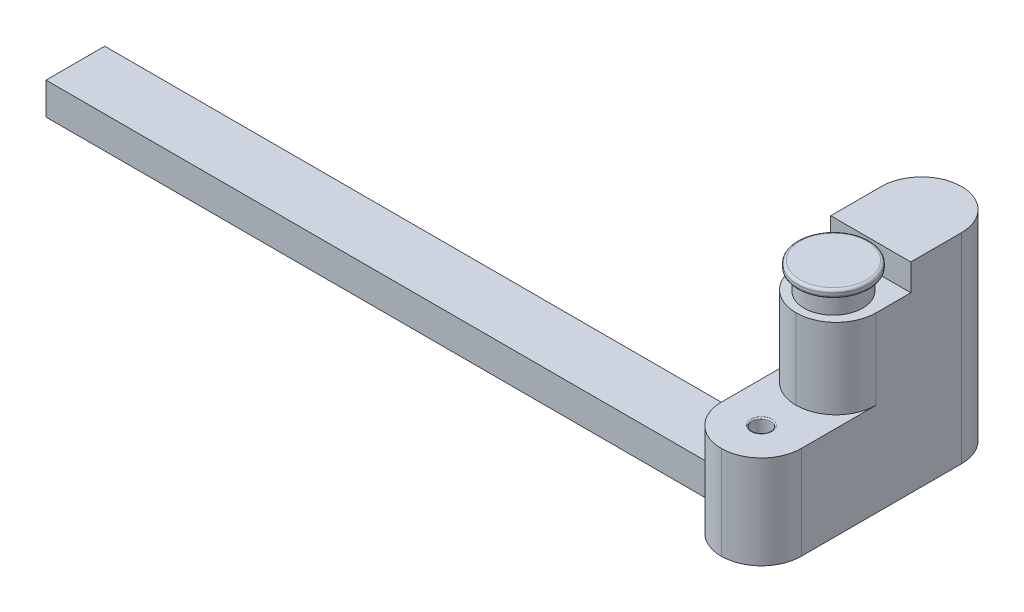
ISO-10303-21;
HEADER;
FILE_DESCRIPTION(('STEP AP214'),'2;1');
FILE_NAME('part.step','',(''),(''),'','','');
FILE_SCHEMA(('AUTOMOTIVE_DESIGN { 1 0 10303 214 1 1 1 1 }'));
ENDSEC;
DATA;
#1=APPLICATION_CONTEXT('core data for automotive mechanical design processes');
#2=APPLICATION_PROTOCOL_DEFINITION('international standard','automotive_design',2000,#1);
#3=PRODUCT_CONTEXT('',#1,'mechanical');
#4=PRODUCT('Part','Part','',(#3));
#5=PRODUCT_RELATED_PRODUCT_CATEGORY('part','',(#4));
#6=PRODUCT_DEFINITION_FORMATION('','',#4);
#7=PRODUCT_DEFINITION_CONTEXT('part definition',#1,'design');
#8=PRODUCT_DEFINITION('design','',#6,#7);
#9=PRODUCT_DEFINITION_SHAPE('','',#8);
#10=(LENGTH_UNIT() NAMED_UNIT(*) SI_UNIT(.MILLI.,.METRE.));
#11=(NAMED_UNIT(*) PLANE_ANGLE_UNIT() SI_UNIT($,.RADIAN.));
#12=(NAMED_UNIT(*) SI_UNIT($,.STERADIAN.) SOLID_ANGLE_UNIT());
#13=UNCERTAINTY_MEASURE_WITH_UNIT(LENGTH_MEASURE(1.E-05),#10,'distance_accuracy_value','');
#14=(GEOMETRIC_REPRESENTATION_CONTEXT(3) GLOBAL_UNCERTAINTY_ASSIGNED_CONTEXT((#13)) GLOBAL_UNIT_ASSIGNED_CONTEXT((#10,
#11,#12)) REPRESENTATION_CONTEXT('',''));
#15=CARTESIAN_POINT('',(0.,0.,0.));
#16=DIRECTION('',(0.,0.,1.));
#17=DIRECTION('',(1.,0.,0.));
#18=AXIS2_PLACEMENT_3D('',#15,#16,#17);
#19=CARTESIAN_POINT('',(58.,28.5,-16.));
#20=DIRECTION('',(0.,-1.,0.));
#21=DIRECTION('',(0.,0.,-1.));
#22=AXIS2_PLACEMENT_3D('',#19,#20,#21);
#23=CYLINDRICAL_SURFACE('',#22,5.49999999999998);
#24=CARTESIAN_POINT('',(58.,23.5,-16.));
#25=DIRECTION('',(0.,1.,0.));
#26=DIRECTION('',(0.,0.,1.));
#27=AXIS2_PLACEMENT_3D('',#24,#25,#26);
#28=CIRCLE('',#27,5.49999999999998);
#29=CARTESIAN_POINT('',(58.,23.5,-10.5));
#30=VERTEX_POINT('',#29);
#31=EDGE_CURVE('E194',#30,#30,#28,.T.);
#32=ORIENTED_EDGE('',*,*,#31,.T.);
#33=EDGE_LOOP('',(#32));
#34=FACE_BOUND('',#33,.T.);
#35=CARTESIAN_POINT('',(58.,27.,-16.));
#36=DIRECTION('',(0.,1.,0.));
#37=DIRECTION('',(0.,0.,1.));
#38=AXIS2_PLACEMENT_3D('',#35,#36,#37);
#39=CIRCLE('',#38,5.49999999999998);
#40=CARTESIAN_POINT('',(58.,27.,-10.5));
#41=VERTEX_POINT('',#40);
#42=EDGE_CURVE('E320',#41,#41,#39,.T.);
#43=ORIENTED_EDGE('',*,*,#42,.F.);
#44=EDGE_LOOP('',(#43));
#45=FACE_BOUND('',#44,.T.);
#46=ADVANCED_FACE('F41',(#34,#45),#23,.T.);
#47=CARTESIAN_POINT('',(50.5,0.,0.));
#48=DIRECTION('',(0.,0.,-1.));
#49=DIRECTION('',(0.,1.,0.));
#50=AXIS2_PLACEMENT_3D('',#47,#48,#49);
#51=PLANE('',#50);
#52=DIRECTION('',(0.,-1.,0.));
#53=VECTOR('',#52,1.);
#54=CARTESIAN_POINT('',(-73.5,0.,0.));
#55=LINE('',#54,#53);
#56=CARTESIAN_POINT('',(-73.5,0.,0.));
#57=VERTEX_POINT('',#56);
#58=CARTESIAN_POINT('',(-73.5,-6.,0.));
#59=VERTEX_POINT('',#58);
#60=EDGE_CURVE('E179',#57,#59,#55,.T.);
#61=ORIENTED_EDGE('',*,*,#60,.T.);
#62=DIRECTION('',(-1.,0.,0.));
#63=VECTOR('',#62,1.);
#64=CARTESIAN_POINT('',(50.5,-6.,0.));
#65=LINE('',#64,#63);
#66=CARTESIAN_POINT('',(50.9289321881344,-6.,0.));
#67=VERTEX_POINT('',#66);
#68=EDGE_CURVE('E64',#67,#59,#65,.T.);
#69=ORIENTED_EDGE('',*,*,#68,.F.);
#70=DIRECTION('',(0.,-1.,0.));
#71=VECTOR('',#70,1.);
#72=CARTESIAN_POINT('',(50.9289321881344,-6.,0.));
#73=LINE('',#72,#71);
#74=CARTESIAN_POINT('',(50.9289321881344,0.,0.));
#75=VERTEX_POINT('',#74);
#76=EDGE_CURVE('E307',#67,#75,#73,.F.);
#77=ORIENTED_EDGE('',*,*,#76,.T.);
#78=DIRECTION('',(-1.,0.,0.));
#79=VECTOR('',#78,1.);
#80=CARTESIAN_POINT('',(50.5,0.,0.));
#81=LINE('',#80,#79);
#82=EDGE_CURVE('E57',#75,#57,#81,.T.);
#83=ORIENTED_EDGE('',*,*,#82,.T.);
#84=EDGE_LOOP('',(#61,#69,#77,#83));
#85=FACE_BOUND('',#84,.T.);
#86=ADVANCED_FACE('F379',(#85),#51,.F.);
#87=CARTESIAN_POINT('',(50.5,-6.,0.));
#88=DIRECTION('',(0.,1.,0.));
#89=DIRECTION('',(0.,0.,1.));
#90=AXIS2_PLACEMENT_3D('',#87,#88,#89);
#91=PLANE('',#90);
#92=DIRECTION('',(0.,0.,-1.));
#93=VECTOR('',#92,1.);
#94=CARTESIAN_POINT('',(-73.5,-6.,0.));
#95=LINE('',#94,#93);
#96=CARTESIAN_POINT('',(-73.5,-6.,-11.));
#97=VERTEX_POINT('',#96);
#98=EDGE_CURVE('E231',#59,#97,#95,.T.);
#99=ORIENTED_EDGE('',*,*,#98,.T.);
#100=DIRECTION('',(-1.,0.,0.));
#101=VECTOR('',#100,1.);
#102=CARTESIAN_POINT('',(50.5,-6.,-11.));
#103=LINE('',#102,#101);
#104=CARTESIAN_POINT('',(50.5,-6.,-11.));
#105=VERTEX_POINT('',#104);
#106=EDGE_CURVE('E245',#105,#97,#103,.T.);
#107=ORIENTED_EDGE('',*,*,#106,.F.);
#108=DIRECTION('',(0.,0.,-1.));
#109=VECTOR('',#108,1.);
#110=CARTESIAN_POINT('',(50.5,-6.,0.));
#111=LINE('',#110,#109);
#112=CARTESIAN_POINT('',(50.5,-6.,-2.5));
#113=VERTEX_POINT('',#112);
#114=EDGE_CURVE('E217',#113,#105,#111,.T.);
#115=ORIENTED_EDGE('',*,*,#114,.F.);
#116=CARTESIAN_POINT('',(58.,-6.,-2.5));
#117=DIRECTION('',(0.,1.,0.));
#118=DIRECTION('',(0.,0.,1.));
#119=AXIS2_PLACEMENT_3D('',#116,#117,#118);
#120=CIRCLE('',#119,7.5);
#121=EDGE_CURVE('E304',#113,#67,#120,.T.);
#122=ORIENTED_EDGE('',*,*,#121,.T.);
#123=ORIENTED_EDGE('',*,*,#68,.T.);
#124=EDGE_LOOP('',(#99,#107,#115,#122,#123));
#125=FACE_BOUND('',#124,.T.);
#126=ADVANCED_FACE('F385',(#125),#91,.F.);
#127=CARTESIAN_POINT('',(50.5,0.,-11.));
#128=DIRECTION('',(0.,0.,1.));
#129=DIRECTION('',(1.,0.,0.));
#130=AXIS2_PLACEMENT_3D('',#127,#128,#129);
#131=PLANE('',#130);
#132=DIRECTION('',(0.,1.,0.));
#133=VECTOR('',#132,1.);
#134=CARTESIAN_POINT('',(-73.5,0.,-11.));
#135=LINE('',#134,#133);
#136=CARTESIAN_POINT('',(-73.5,0.,-11.));
#137=VERTEX_POINT('',#136);
#138=EDGE_CURVE('E234',#97,#137,#135,.T.);
#139=ORIENTED_EDGE('',*,*,#138,.T.);
#140=DIRECTION('',(-1.,0.,0.));
#141=VECTOR('',#140,1.);
#142=CARTESIAN_POINT('',(50.5,0.,-11.));
#143=LINE('',#142,#141);
#144=CARTESIAN_POINT('',(50.5,0.,-11.));
#145=VERTEX_POINT('',#144);
#146=EDGE_CURVE('E241',#145,#137,#143,.T.);
#147=ORIENTED_EDGE('',*,*,#146,.F.);
#148=DIRECTION('',(0.,1.,0.));
#149=VECTOR('',#148,1.);
#150=CARTESIAN_POINT('',(50.5,0.,-11.));
#151=LINE('',#150,#149);
#152=EDGE_CURVE('E220',#105,#145,#151,.T.);
#153=ORIENTED_EDGE('',*,*,#152,.F.);
#154=ORIENTED_EDGE('',*,*,#106,.T.);
#155=EDGE_LOOP('',(#139,#147,#153,#154));
#156=FACE_BOUND('',#155,.T.);
#157=ADVANCED_FACE('F424',(#156),#131,.F.);
#158=CARTESIAN_POINT('',(50.5,0.,0.));
#159=DIRECTION('',(0.,-1.,0.));
#160=DIRECTION('',(0.,0.,-1.));
#161=AXIS2_PLACEMENT_3D('',#158,#159,#160);
#162=PLANE('',#161);
#163=DIRECTION('',(0.,0.,1.));
#164=VECTOR('',#163,1.);
#165=CARTESIAN_POINT('',(-73.5,0.,0.));
#166=LINE('',#165,#164);
#167=EDGE_CURVE('E221',#137,#57,#166,.T.);
#168=ORIENTED_EDGE('',*,*,#167,.T.);
#169=ORIENTED_EDGE('',*,*,#82,.F.);
#170=CARTESIAN_POINT('',(58.,0.,-2.5));
#171=DIRECTION('',(0.,-1.,0.));
#172=DIRECTION('',(0.,0.,-1.));
#173=AXIS2_PLACEMENT_3D('',#170,#171,#172);
#174=CIRCLE('',#173,7.5);
#175=CARTESIAN_POINT('',(50.5,0.,-2.5));
#176=VERTEX_POINT('',#175);
#177=EDGE_CURVE('E310',#75,#176,#174,.T.);
#178=ORIENTED_EDGE('',*,*,#177,.T.);
#179=DIRECTION('',(0.,0.,1.));
#180=VECTOR('',#179,1.);
#181=CARTESIAN_POINT('',(50.5,0.,0.));
#182=LINE('',#181,#180);
#183=EDGE_CURVE('E225',#145,#176,#182,.T.);
#184=ORIENTED_EDGE('',*,*,#183,.F.);
#185=ORIENTED_EDGE('',*,*,#146,.T.);
#186=EDGE_LOOP('',(#168,#169,#178,#184,#185));
#187=FACE_BOUND('',#186,.T.);
#188=ADVANCED_FACE('F420',(#187),#162,.F.);
#189=CARTESIAN_POINT('',(-73.5,0.,0.));
#190=DIRECTION('',(1.,0.,0.));
#191=DIRECTION('',(0.,0.,-1.));
#192=AXIS2_PLACEMENT_3D('',#189,#190,#191);
#193=PLANE('',#192);
#194=ORIENTED_EDGE('',*,*,#60,.F.);
#195=ORIENTED_EDGE('',*,*,#167,.F.);
#196=ORIENTED_EDGE('',*,*,#138,.F.);
#197=ORIENTED_EDGE('',*,*,#98,.F.);
#198=EDGE_LOOP('',(#194,#195,#196,#197));
#199=FACE_BOUND('',#198,.T.);
#200=ADVANCED_FACE('F400',(#199),#193,.F.);
#201=CARTESIAN_POINT('',(50.5,0.,0.));
#202=DIRECTION('',(1.,0.,0.));
#203=DIRECTION('',(0.,0.,-1.));
#204=AXIS2_PLACEMENT_3D('',#201,#202,#203);
#205=PLANE('',#204);
#206=DIRECTION('',(0.,0.,-1.));
#207=VECTOR('',#206,1.);
#208=CARTESIAN_POINT('',(50.5,28.5,0.));
#209=LINE('',#208,#207);
#210=CARTESIAN_POINT('',(50.5,28.5,-23.));
#211=VERTEX_POINT('',#210);
#212=CARTESIAN_POINT('',(50.5,28.5,-32.5));
#213=VERTEX_POINT('',#212);
#214=EDGE_CURVE('E187',#211,#213,#209,.T.);
#215=ORIENTED_EDGE('',*,*,#214,.T.);
#216=DIRECTION('',(0.,1.,0.));
#217=VECTOR('',#216,1.);
#218=CARTESIAN_POINT('',(50.5,0.,-32.5));
#219=LINE('',#218,#217);
#220=CARTESIAN_POINT('',(50.5,-9.,-32.5));
#221=VERTEX_POINT('',#220);
#222=EDGE_CURVE('E268',#213,#221,#219,.F.);
#223=ORIENTED_EDGE('',*,*,#222,.T.);
#224=DIRECTION('',(0.,0.,-1.));
#225=VECTOR('',#224,1.);
#226=CARTESIAN_POINT('',(50.5,-9.,0.));
#227=LINE('',#226,#225);
#228=CARTESIAN_POINT('',(50.5,-9.,-2.5));
#229=VERTEX_POINT('',#228);
#230=EDGE_CURVE('E191',#229,#221,#227,.T.);
#231=ORIENTED_EDGE('',*,*,#230,.F.);
#232=DIRECTION('',(0.,1.,0.));
#233=VECTOR('',#232,1.);
#234=CARTESIAN_POINT('',(50.5,8.5,-2.5));
#235=LINE('',#234,#233);
#236=EDGE_CURVE('E264',#229,#113,#235,.T.);
#237=ORIENTED_EDGE('',*,*,#236,.T.);
#238=ORIENTED_EDGE('',*,*,#114,.T.);
#239=ORIENTED_EDGE('',*,*,#152,.T.);
#240=ORIENTED_EDGE('',*,*,#183,.T.);
#241=DIRECTION('',(0.,1.,0.));
#242=VECTOR('',#241,1.);
#243=CARTESIAN_POINT('',(50.5,8.5,-2.5));
#244=LINE('',#243,#242);
#245=CARTESIAN_POINT('',(50.5,8.5,-2.5));
#246=VERTEX_POINT('',#245);
#247=EDGE_CURVE('E261',#176,#246,#244,.T.);
#248=ORIENTED_EDGE('',*,*,#247,.T.);
#249=DIRECTION('',(0.,0.,-1.));
#250=VECTOR('',#249,1.);
#251=CARTESIAN_POINT('',(50.5,8.5,0.));
#252=LINE('',#251,#250);
#253=CARTESIAN_POINT('',(50.5,8.5,-16.5));
#254=VERTEX_POINT('',#253);
#255=EDGE_CURVE('E209',#246,#254,#252,.T.);
#256=ORIENTED_EDGE('',*,*,#255,.T.);
#257=DIRECTION('',(0.,1.,0.));
#258=VECTOR('',#257,1.);
#259=CARTESIAN_POINT('',(50.5,23.5,-16.5));
#260=LINE('',#259,#258);
#261=CARTESIAN_POINT('',(50.5,23.5,-16.5));
#262=VERTEX_POINT('',#261);
#263=EDGE_CURVE('E257',#254,#262,#260,.T.);
#264=ORIENTED_EDGE('',*,*,#263,.T.);
#265=DIRECTION('',(0.,0.,-1.));
#266=VECTOR('',#265,1.);
#267=CARTESIAN_POINT('',(50.5,23.5,0.));
#268=LINE('',#267,#266);
#269=CARTESIAN_POINT('',(50.5,23.5,-23.));
#270=VERTEX_POINT('',#269);
#271=EDGE_CURVE('E205',#262,#270,#268,.T.);
#272=ORIENTED_EDGE('',*,*,#271,.T.);
#273=DIRECTION('',(0.,1.,0.));
#274=VECTOR('',#273,1.);
#275=CARTESIAN_POINT('',(50.5,0.,-23.));
#276=LINE('',#275,#274);
#277=EDGE_CURVE('E177',#270,#211,#276,.T.);
#278=ORIENTED_EDGE('',*,*,#277,.T.);
#279=EDGE_LOOP('',(#215,#223,#231,#237,#238,#239,#240,#248,#256,#264,#272,#278));
#280=FACE_BOUND('',#279,.T.);
#281=ADVANCED_FACE('F397',(#280),#205,.F.);
#282=CARTESIAN_POINT('',(65.5,0.,-23.));
#283=DIRECTION('',(0.,0.,1.));
#284=DIRECTION('',(1.,0.,0.));
#285=AXIS2_PLACEMENT_3D('',#282,#283,#284);
#286=PLANE('',#285);
#287=ORIENTED_EDGE('',*,*,#277,.F.);
#288=DIRECTION('',(-1.,0.,0.));
#289=VECTOR('',#288,1.);
#290=CARTESIAN_POINT('',(65.5,23.5,-23.));
#291=LINE('',#290,#289);
#292=CARTESIAN_POINT('',(65.5,23.5,-23.));
#293=VERTEX_POINT('',#292);
#294=EDGE_CURVE('E160',#293,#270,#291,.T.);
#295=ORIENTED_EDGE('',*,*,#294,.F.);
#296=DIRECTION('',(0.,1.,0.));
#297=VECTOR('',#296,1.);
#298=CARTESIAN_POINT('',(65.5,0.,-23.));
#299=LINE('',#298,#297);
#300=CARTESIAN_POINT('',(65.5,28.5,-23.));
#301=VERTEX_POINT('',#300);
#302=EDGE_CURVE('E170',#293,#301,#299,.T.);
#303=ORIENTED_EDGE('',*,*,#302,.T.);
#304=DIRECTION('',(-1.,0.,0.));
#305=VECTOR('',#304,1.);
#306=CARTESIAN_POINT('',(65.5,28.5,-23.));
#307=LINE('',#306,#305);
#308=EDGE_CURVE('E180',#301,#211,#307,.T.);
#309=ORIENTED_EDGE('',*,*,#308,.T.);
#310=EDGE_LOOP('',(#287,#295,#303,#309));
#311=FACE_BOUND('',#310,.T.);
#312=ADVANCED_FACE('F174',(#311),#286,.T.);
#313=CARTESIAN_POINT('',(65.5,23.5,0.));
#314=DIRECTION('',(0.,1.,0.));
#315=DIRECTION('',(0.,0.,1.));
#316=AXIS2_PLACEMENT_3D('',#313,#314,#315);
#317=PLANE('',#316);
#318=ORIENTED_EDGE('',*,*,#31,.F.);
#319=EDGE_LOOP('',(#318));
#320=FACE_BOUND('',#319,.T.);
#321=ORIENTED_EDGE('',*,*,#271,.F.);
#322=CARTESIAN_POINT('',(58.,23.5,-16.5));
#323=DIRECTION('',(0.,1.,0.));
#324=DIRECTION('',(0.,0.,1.));
#325=AXIS2_PLACEMENT_3D('',#322,#323,#324);
#326=CIRCLE('',#325,7.5);
#327=CARTESIAN_POINT('',(58.,23.5,-9.));
#328=VERTEX_POINT('',#327);
#329=EDGE_CURVE('E301',#262,#328,#326,.T.);
#330=ORIENTED_EDGE('',*,*,#329,.T.);
#331=CARTESIAN_POINT('',(58.,23.5,-16.5));
#332=DIRECTION('',(0.,1.,0.));
#333=DIRECTION('',(0.,0.,1.));
#334=AXIS2_PLACEMENT_3D('',#331,#332,#333);
#335=CIRCLE('',#334,7.5);
#336=CARTESIAN_POINT('',(65.5,23.5,-16.5));
#337=VERTEX_POINT('',#336);
#338=EDGE_CURVE('E163',#328,#337,#335,.T.);
#339=ORIENTED_EDGE('',*,*,#338,.T.);
#340=DIRECTION('',(0.,0.,-1.));
#341=VECTOR('',#340,1.);
#342=CARTESIAN_POINT('',(65.5,23.5,0.));
#343=LINE('',#342,#341);
#344=EDGE_CURVE('E156',#337,#293,#343,.T.);
#345=ORIENTED_EDGE('',*,*,#344,.T.);
#346=ORIENTED_EDGE('',*,*,#294,.T.);
#347=EDGE_LOOP('',(#321,#330,#339,#345,#346));
#348=FACE_BOUND('',#347,.T.);
#349=ADVANCED_FACE('F159',(#320,#348),#317,.T.);
#350=CARTESIAN_POINT('',(65.5,8.5,0.));
#351=DIRECTION('',(0.,1.,0.));
#352=DIRECTION('',(0.,0.,1.));
#353=AXIS2_PLACEMENT_3D('',#350,#351,#352);
#354=PLANE('',#353);
#355=CARTESIAN_POINT('',(58.,8.5,-2.5));
#356=DIRECTION('',(0.,1.,0.));
#357=DIRECTION('',(0.,0.,1.));
#358=AXIS2_PLACEMENT_3D('',#355,#356,#357);
#359=CIRCLE('',#358,1.99999999999998);
#360=CARTESIAN_POINT('',(58.,8.5,-0.500000000000018));
#361=VERTEX_POINT('',#360);
#362=EDGE_CURVE('E11',#361,#361,#359,.F.);
#363=ORIENTED_EDGE('',*,*,#362,.T.);
#364=EDGE_LOOP('',(#363));
#365=FACE_BOUND('',#364,.T.);
#366=ORIENTED_EDGE('',*,*,#255,.F.);
#367=CARTESIAN_POINT('',(58.,8.5,-2.5));
#368=DIRECTION('',(0.,1.,0.));
#369=DIRECTION('',(0.,0.,1.));
#370=AXIS2_PLACEMENT_3D('',#367,#368,#369);
#371=CIRCLE('',#370,7.5);
#372=CARTESIAN_POINT('',(58.,8.5,5.));
#373=VERTEX_POINT('',#372);
#374=EDGE_CURVE('E296',#246,#373,#371,.T.);
#375=ORIENTED_EDGE('',*,*,#374,.T.);
#376=CARTESIAN_POINT('',(58.,8.5,-2.5));
#377=DIRECTION('',(0.,1.,0.));
#378=DIRECTION('',(0.,0.,1.));
#379=AXIS2_PLACEMENT_3D('',#376,#377,#378);
#380=CIRCLE('',#379,7.5);
#381=CARTESIAN_POINT('',(65.5,8.5,-2.5));
#382=VERTEX_POINT('',#381);
#383=EDGE_CURVE('E293',#373,#382,#380,.T.);
#384=ORIENTED_EDGE('',*,*,#383,.T.);
#385=DIRECTION('',(0.,0.,-1.));
#386=VECTOR('',#385,1.);
#387=CARTESIAN_POINT('',(65.5,8.5,0.));
#388=LINE('',#387,#386);
#389=CARTESIAN_POINT('',(65.5,8.5,-16.5));
#390=VERTEX_POINT('',#389);
#391=EDGE_CURVE('E169',#382,#390,#388,.T.);
#392=ORIENTED_EDGE('',*,*,#391,.T.);
#393=CARTESIAN_POINT('',(58.,8.5,-16.5));
#394=DIRECTION('',(0.,1.,0.));
#395=DIRECTION('',(0.,0.,1.));
#396=AXIS2_PLACEMENT_3D('',#393,#394,#395);
#397=CIRCLE('',#396,7.5);
#398=CARTESIAN_POINT('',(58.,8.5,-9.));
#399=VERTEX_POINT('',#398);
#400=EDGE_CURVE('E317',#390,#399,#397,.F.);
#401=ORIENTED_EDGE('',*,*,#400,.T.);
#402=CARTESIAN_POINT('',(58.,8.5,-16.5));
#403=DIRECTION('',(0.,1.,0.));
#404=DIRECTION('',(0.,0.,1.));
#405=AXIS2_PLACEMENT_3D('',#402,#403,#404);
#406=CIRCLE('',#405,7.5);
#407=EDGE_CURVE('E313',#399,#254,#406,.F.);
#408=ORIENTED_EDGE('',*,*,#407,.T.);
#409=EDGE_LOOP('',(#366,#375,#384,#392,#401,#408));
#410=FACE_BOUND('',#409,.T.);
#411=ADVANCED_FACE('F408',(#365,#410),#354,.T.);
#412=CARTESIAN_POINT('',(65.5,-9.,0.));
#413=DIRECTION('',(0.,1.,0.));
#414=DIRECTION('',(0.,0.,1.));
#415=AXIS2_PLACEMENT_3D('',#412,#413,#414);
#416=PLANE('',#415);
#417=ORIENTED_EDGE('',*,*,#230,.T.);
#418=CARTESIAN_POINT('',(58.,-9.,-32.5));
#419=DIRECTION('',(0.,1.,0.));
#420=DIRECTION('',(0.,0.,1.));
#421=AXIS2_PLACEMENT_3D('',#418,#419,#420);
#422=CIRCLE('',#421,7.5);
#423=CARTESIAN_POINT('',(58.,-9.,-40.));
#424=VERTEX_POINT('',#423);
#425=EDGE_CURVE('E281',#221,#424,#422,.F.);
#426=ORIENTED_EDGE('',*,*,#425,.T.);
#427=CARTESIAN_POINT('',(58.,-9.,-32.5));
#428=DIRECTION('',(0.,1.,0.));
#429=DIRECTION('',(0.,0.,1.));
#430=AXIS2_PLACEMENT_3D('',#427,#428,#429);
#431=CIRCLE('',#430,7.5);
#432=CARTESIAN_POINT('',(65.5,-9.,-32.5));
#433=VERTEX_POINT('',#432);
#434=EDGE_CURVE('E278',#424,#433,#431,.F.);
#435=ORIENTED_EDGE('',*,*,#434,.T.);
#436=DIRECTION('',(0.,0.,-1.));
#437=VECTOR('',#436,1.);
#438=CARTESIAN_POINT('',(65.5,-9.,0.));
#439=LINE('',#438,#437);
#440=CARTESIAN_POINT('',(65.5,-9.,-2.5));
#441=VERTEX_POINT('',#440);
#442=EDGE_CURVE('E198',#441,#433,#439,.T.);
#443=ORIENTED_EDGE('',*,*,#442,.F.);
#444=CARTESIAN_POINT('',(58.,-9.,-2.5));
#445=DIRECTION('',(0.,1.,0.));
#446=DIRECTION('',(0.,0.,1.));
#447=AXIS2_PLACEMENT_3D('',#444,#445,#446);
#448=CIRCLE('',#447,7.5);
#449=CARTESIAN_POINT('',(58.,-9.,5.));
#450=VERTEX_POINT('',#449);
#451=EDGE_CURVE('E272',#441,#450,#448,.F.);
#452=ORIENTED_EDGE('',*,*,#451,.T.);
#453=CARTESIAN_POINT('',(58.,-9.,-2.5));
#454=DIRECTION('',(0.,1.,0.));
#455=DIRECTION('',(0.,0.,1.));
#456=AXIS2_PLACEMENT_3D('',#453,#454,#455);
#457=CIRCLE('',#456,7.5);
#458=EDGE_CURVE('E275',#450,#229,#457,.F.);
#459=ORIENTED_EDGE('',*,*,#458,.T.);
#460=EDGE_LOOP('',(#417,#426,#435,#443,#452,#459));
#461=FACE_BOUND('',#460,.T.);
#462=ADVANCED_FACE('F404',(#461),#416,.F.);
#463=CARTESIAN_POINT('',(65.5,28.5,0.));
#464=DIRECTION('',(0.,1.,0.));
#465=DIRECTION('',(0.,0.,1.));
#466=AXIS2_PLACEMENT_3D('',#463,#464,#465);
#467=PLANE('',#466);
#468=CARTESIAN_POINT('',(58.,28.5,-32.5));
#469=DIRECTION('',(0.,1.,0.));
#470=DIRECTION('',(0.,0.,1.));
#471=AXIS2_PLACEMENT_3D('',#468,#469,#470);
#472=CIRCLE('',#471,7.5);
#473=CARTESIAN_POINT('',(65.5,28.5,-32.5));
#474=VERTEX_POINT('',#473);
#475=CARTESIAN_POINT('',(58.,28.5,-40.));
#476=VERTEX_POINT('',#475);
#477=EDGE_CURVE('E251',#474,#476,#472,.T.);
#478=ORIENTED_EDGE('',*,*,#477,.T.);
#479=CARTESIAN_POINT('',(58.,28.5,-32.5));
#480=DIRECTION('',(0.,1.,0.));
#481=DIRECTION('',(0.,0.,1.));
#482=AXIS2_PLACEMENT_3D('',#479,#480,#481);
#483=CIRCLE('',#482,7.5);
#484=EDGE_CURVE('E254',#476,#213,#483,.T.);
#485=ORIENTED_EDGE('',*,*,#484,.T.);
#486=ORIENTED_EDGE('',*,*,#214,.F.);
#487=ORIENTED_EDGE('',*,*,#308,.F.);
#488=DIRECTION('',(0.,0.,-1.));
#489=VECTOR('',#488,1.);
#490=CARTESIAN_POINT('',(65.5,28.5,0.));
#491=LINE('',#490,#489);
#492=EDGE_CURVE('E185',#301,#474,#491,.T.);
#493=ORIENTED_EDGE('',*,*,#492,.T.);
#494=EDGE_LOOP('',(#478,#485,#486,#487,#493));
#495=FACE_BOUND('',#494,.T.);
#496=ADVANCED_FACE('F396',(#495),#467,.T.);
#497=CARTESIAN_POINT('',(65.5,0.,0.));
#498=DIRECTION('',(1.,0.,0.));
#499=DIRECTION('',(0.,0.,-1.));
#500=AXIS2_PLACEMENT_3D('',#497,#498,#499);
#501=PLANE('',#500);
#502=ORIENTED_EDGE('',*,*,#442,.T.);
#503=DIRECTION('',(0.,1.,0.));
#504=VECTOR('',#503,1.);
#505=CARTESIAN_POINT('',(65.5,28.5,-32.5));
#506=LINE('',#505,#504);
#507=EDGE_CURVE('E290',#433,#474,#506,.T.);
#508=ORIENTED_EDGE('',*,*,#507,.T.);
#509=ORIENTED_EDGE('',*,*,#492,.F.);
#510=ORIENTED_EDGE('',*,*,#302,.F.);
#511=ORIENTED_EDGE('',*,*,#344,.F.);
#512=DIRECTION('',(0.,1.,0.));
#513=VECTOR('',#512,1.);
#514=CARTESIAN_POINT('',(65.5,0.,-16.5));
#515=LINE('',#514,#513);
#516=EDGE_CURVE('E284',#337,#390,#515,.F.);
#517=ORIENTED_EDGE('',*,*,#516,.T.);
#518=ORIENTED_EDGE('',*,*,#391,.F.);
#519=DIRECTION('',(0.,1.,0.));
#520=VECTOR('',#519,1.);
#521=CARTESIAN_POINT('',(65.5,0.,-2.5));
#522=LINE('',#521,#520);
#523=EDGE_CURVE('E287',#382,#441,#522,.F.);
#524=ORIENTED_EDGE('',*,*,#523,.T.);
#525=EDGE_LOOP('',(#502,#508,#509,#510,#511,#517,#518,#524));
#526=FACE_BOUND('',#525,.T.);
#527=ADVANCED_FACE('F183',(#526),#501,.T.);
#528=CARTESIAN_POINT('',(58.,0.,-32.5));
#529=DIRECTION('',(0.,-1.,0.));
#530=DIRECTION('',(0.,0.,-1.));
#531=AXIS2_PLACEMENT_3D('',#528,#529,#530);
#532=CYLINDRICAL_SURFACE('',#531,7.5);
#533=ORIENTED_EDGE('',*,*,#507,.F.);
#534=ORIENTED_EDGE('',*,*,#434,.F.);
#535=DIRECTION('',(0.,1.,0.));
#536=VECTOR('',#535,1.);
#537=CARTESIAN_POINT('',(58.,-9.,-40.));
#538=LINE('',#537,#536);
#539=EDGE_CURVE('E206',#476,#424,#538,.F.);
#540=ORIENTED_EDGE('',*,*,#539,.F.);
#541=ORIENTED_EDGE('',*,*,#477,.F.);
#542=EDGE_LOOP('',(#533,#534,#540,#541));
#543=FACE_BOUND('',#542,.T.);
#544=ADVANCED_FACE('F395',(#543),#532,.T.);
#545=CARTESIAN_POINT('',(58.,0.,-32.5));
#546=DIRECTION('',(0.,1.,0.));
#547=DIRECTION('',(0.,0.,1.));
#548=AXIS2_PLACEMENT_3D('',#545,#546,#547);
#549=CYLINDRICAL_SURFACE('',#548,7.5);
#550=ORIENTED_EDGE('',*,*,#425,.F.);
#551=ORIENTED_EDGE('',*,*,#222,.F.);
#552=ORIENTED_EDGE('',*,*,#484,.F.);
#553=ORIENTED_EDGE('',*,*,#539,.T.);
#554=EDGE_LOOP('',(#550,#551,#552,#553));
#555=FACE_BOUND('',#554,.T.);
#556=ADVANCED_FACE('F431',(#555),#549,.T.);
#557=CARTESIAN_POINT('',(58.,0.,-2.5));
#558=DIRECTION('',(0.,1.,0.));
#559=DIRECTION('',(0.,0.,1.));
#560=AXIS2_PLACEMENT_3D('',#557,#558,#559);
#561=CYLINDRICAL_SURFACE('',#560,7.5);
#562=DIRECTION('',(0.,1.,0.));
#563=VECTOR('',#562,1.);
#564=CARTESIAN_POINT('',(58.,0.,5.));
#565=LINE('',#564,#563);
#566=EDGE_CURVE('E324',#450,#373,#565,.T.);
#567=ORIENTED_EDGE('',*,*,#566,.F.);
#568=ORIENTED_EDGE('',*,*,#451,.F.);
#569=ORIENTED_EDGE('',*,*,#523,.F.);
#570=ORIENTED_EDGE('',*,*,#383,.F.);
#571=EDGE_LOOP('',(#567,#568,#569,#570));
#572=FACE_BOUND('',#571,.T.);
#573=ADVANCED_FACE('F434',(#572),#561,.T.);
#574=CARTESIAN_POINT('',(58.,0.,-2.5));
#575=DIRECTION('',(0.,-1.,0.));
#576=DIRECTION('',(0.,0.,-1.));
#577=AXIS2_PLACEMENT_3D('',#574,#575,#576);
#578=CYLINDRICAL_SURFACE('',#577,7.5);
#579=ORIENTED_EDGE('',*,*,#458,.F.);
#580=ORIENTED_EDGE('',*,*,#566,.T.);
#581=ORIENTED_EDGE('',*,*,#374,.F.);
#582=ORIENTED_EDGE('',*,*,#247,.F.);
#583=ORIENTED_EDGE('',*,*,#177,.F.);
#584=ORIENTED_EDGE('',*,*,#76,.F.);
#585=ORIENTED_EDGE('',*,*,#121,.F.);
#586=ORIENTED_EDGE('',*,*,#236,.F.);
#587=EDGE_LOOP('',(#579,#580,#581,#582,#583,#584,#585,#586));
#588=FACE_BOUND('',#587,.T.);
#589=ADVANCED_FACE('F439',(#588),#578,.T.);
#590=CARTESIAN_POINT('',(58.,0.,-16.5));
#591=DIRECTION('',(0.,1.,0.));
#592=DIRECTION('',(0.,0.,1.));
#593=AXIS2_PLACEMENT_3D('',#590,#591,#592);
#594=CYLINDRICAL_SURFACE('',#593,7.5);
#595=DIRECTION('',(0.,1.,0.));
#596=VECTOR('',#595,1.);
#597=CARTESIAN_POINT('',(58.,0.,-9.));
#598=LINE('',#597,#596);
#599=EDGE_CURVE('E328',#399,#328,#598,.T.);
#600=ORIENTED_EDGE('',*,*,#599,.F.);
#601=ORIENTED_EDGE('',*,*,#400,.F.);
#602=ORIENTED_EDGE('',*,*,#516,.F.);
#603=ORIENTED_EDGE('',*,*,#338,.F.);
#604=EDGE_LOOP('',(#600,#601,#602,#603));
#605=FACE_BOUND('',#604,.T.);
#606=ADVANCED_FACE('F442',(#605),#594,.T.);
#607=CARTESIAN_POINT('',(58.,0.,-16.5));
#608=DIRECTION('',(0.,-1.,0.));
#609=DIRECTION('',(0.,0.,-1.));
#610=AXIS2_PLACEMENT_3D('',#607,#608,#609);
#611=CYLINDRICAL_SURFACE('',#610,7.5);
#612=ORIENTED_EDGE('',*,*,#407,.F.);
#613=ORIENTED_EDGE('',*,*,#599,.T.);
#614=ORIENTED_EDGE('',*,*,#329,.F.);
#615=ORIENTED_EDGE('',*,*,#263,.F.);
#616=EDGE_LOOP('',(#612,#613,#614,#615));
#617=FACE_BOUND('',#616,.T.);
#618=ADVANCED_FACE('F447',(#617),#611,.T.);
#619=CARTESIAN_POINT('',(58.,27.,-16.));
#620=DIRECTION('',(0.,1.,0.));
#621=DIRECTION('',(0.,0.,1.));
#622=AXIS2_PLACEMENT_3D('',#619,#620,#621);
#623=CYLINDRICAL_SURFACE('',#622,6.74999999999998);
#624=CARTESIAN_POINT('',(58.,28.,-16.));
#625=DIRECTION('',(0.,1.,0.));
#626=DIRECTION('',(0.,0.,1.));
#627=AXIS2_PLACEMENT_3D('',#624,#625,#626);
#628=CIRCLE('',#627,6.74999999999998);
#629=CARTESIAN_POINT('',(58.,28.,-9.25000000000002));
#630=VERTEX_POINT('',#629);
#631=EDGE_CURVE('E343',#630,#630,#628,.F.);
#632=ORIENTED_EDGE('',*,*,#631,.T.);
#633=EDGE_LOOP('',(#632));
#634=FACE_BOUND('',#633,.T.);
#635=CARTESIAN_POINT('',(58.,27.5,-16.));
#636=DIRECTION('',(0.,1.,0.));
#637=DIRECTION('',(0.,0.,1.));
#638=AXIS2_PLACEMENT_3D('',#635,#636,#637);
#639=CIRCLE('',#638,6.74999999999998);
#640=CARTESIAN_POINT('',(58.,27.5,-9.25000000000002));
#641=VERTEX_POINT('',#640);
#642=EDGE_CURVE('E339',#641,#641,#639,.T.);
#643=ORIENTED_EDGE('',*,*,#642,.T.);
#644=EDGE_LOOP('',(#643));
#645=FACE_BOUND('',#644,.T.);
#646=ADVANCED_FACE('F450',(#634,#645),#623,.T.);
#647=CARTESIAN_POINT('',(58.,27.,-16.));
#648=DIRECTION('',(0.,1.,0.));
#649=DIRECTION('',(0.,0.,1.));
#650=AXIS2_PLACEMENT_3D('',#647,#648,#649);
#651=PLANE('',#650);
#652=CARTESIAN_POINT('',(58.,27.,-16.));
#653=DIRECTION('',(0.,1.,0.));
#654=DIRECTION('',(0.,0.,1.));
#655=AXIS2_PLACEMENT_3D('',#652,#653,#654);
#656=CIRCLE('',#655,6.24999999999998);
#657=CARTESIAN_POINT('',(58.,27.,-9.75000000000002));
#658=VERTEX_POINT('',#657);
#659=EDGE_CURVE('E347',#658,#658,#656,.F.);
#660=ORIENTED_EDGE('',*,*,#659,.T.);
#661=EDGE_LOOP('',(#660));
#662=FACE_BOUND('',#661,.T.);
#663=ORIENTED_EDGE('',*,*,#42,.T.);
#664=EDGE_LOOP('',(#663));
#665=FACE_BOUND('',#664,.T.);
#666=ADVANCED_FACE('F468',(#662,#665),#651,.F.);
#667=CARTESIAN_POINT('',(58.,28.5,-16.));
#668=DIRECTION('',(0.,1.,0.));
#669=DIRECTION('',(0.,0.,1.));
#670=AXIS2_PLACEMENT_3D('',#667,#668,#669);
#671=PLANE('',#670);
#672=CARTESIAN_POINT('',(58.,28.5,-16.));
#673=DIRECTION('',(0.,1.,0.));
#674=DIRECTION('',(0.,0.,1.));
#675=AXIS2_PLACEMENT_3D('',#672,#673,#674);
#676=CIRCLE('',#675,6.24999999999998);
#677=CARTESIAN_POINT('',(58.,28.5,-9.75000000000002));
#678=VERTEX_POINT('',#677);
#679=EDGE_CURVE('E335',#678,#678,#676,.T.);
#680=ORIENTED_EDGE('',*,*,#679,.T.);
#681=EDGE_LOOP('',(#680));
#682=FACE_BOUND('',#681,.T.);
#683=ADVANCED_FACE('F391',(#682),#671,.T.);
#684=CARTESIAN_POINT('',(58.,28.,-16.));
#685=DIRECTION('',(0.,1.,0.));
#686=DIRECTION('',(0.,0.,1.));
#687=AXIS2_PLACEMENT_3D('',#684,#685,#686);
#688=TOROIDAL_SURFACE('',#687,6.24999999999998,0.5);
#689=ORIENTED_EDGE('',*,*,#631,.F.);
#690=EDGE_LOOP('',(#689));
#691=FACE_BOUND('',#690,.T.);
#692=ORIENTED_EDGE('',*,*,#679,.F.);
#693=EDGE_LOOP('',(#692));
#694=FACE_BOUND('',#693,.T.);
#695=ADVANCED_FACE('F455',(#691,#694),#688,.T.);
#696=CARTESIAN_POINT('',(58.,27.5,-16.));
#697=DIRECTION('',(0.,1.,0.));
#698=DIRECTION('',(0.,0.,1.));
#699=AXIS2_PLACEMENT_3D('',#696,#697,#698);
#700=TOROIDAL_SURFACE('',#699,6.24999999999998,0.5);
#701=ORIENTED_EDGE('',*,*,#659,.F.);
#702=EDGE_LOOP('',(#701));
#703=FACE_BOUND('',#702,.T.);
#704=ORIENTED_EDGE('',*,*,#642,.F.);
#705=EDGE_LOOP('',(#704));
#706=FACE_BOUND('',#705,.T.);
#707=ADVANCED_FACE('F376',(#703,#706),#700,.T.);
#708=CARTESIAN_POINT('',(58.,5.5,-2.5));
#709=DIRECTION('',(0.,1.,0.));
#710=DIRECTION('',(0.,0.,1.));
#711=AXIS2_PLACEMENT_3D('',#708,#709,#710);
#712=CYLINDRICAL_SURFACE('',#711,1.74999999999998);
#713=CARTESIAN_POINT('',(58.,5.75,-2.5));
#714=DIRECTION('',(0.,1.,0.));
#715=DIRECTION('',(0.,0.,1.));
#716=AXIS2_PLACEMENT_3D('',#713,#714,#715);
#717=CIRCLE('',#716,1.74999999999998);
#718=CARTESIAN_POINT('',(58.,5.75,-0.750000000000018));
#719=VERTEX_POINT('',#718);
#720=EDGE_CURVE('E50',#719,#719,#717,.F.);
#721=ORIENTED_EDGE('',*,*,#720,.T.);
#722=EDGE_LOOP('',(#721));
#723=FACE_BOUND('',#722,.T.);
#724=CARTESIAN_POINT('',(58.,8.25,-2.5));
#725=DIRECTION('',(0.,1.,0.));
#726=DIRECTION('',(0.,0.,1.));
#727=AXIS2_PLACEMENT_3D('',#724,#725,#726);
#728=CIRCLE('',#727,1.74999999999998);
#729=CARTESIAN_POINT('',(58.,8.25,-0.750000000000018));
#730=VERTEX_POINT('',#729);
#731=EDGE_CURVE('E355',#730,#730,#728,.T.);
#732=ORIENTED_EDGE('',*,*,#731,.T.);
#733=EDGE_LOOP('',(#732));
#734=FACE_BOUND('',#733,.T.);
#735=ADVANCED_FACE('F362',(#723,#734),#712,.F.);
#736=CARTESIAN_POINT('',(58.,5.5,-2.5));
#737=DIRECTION('',(0.,1.,0.));
#738=DIRECTION('',(0.,0.,1.));
#739=AXIS2_PLACEMENT_3D('',#736,#737,#738);
#740=PLANE('',#739);
#741=CARTESIAN_POINT('',(58.,5.5,-2.5));
#742=DIRECTION('',(0.,1.,0.));
#743=DIRECTION('',(0.,0.,1.));
#744=AXIS2_PLACEMENT_3D('',#741,#742,#743);
#745=CIRCLE('',#744,1.49999999999998);
#746=CARTESIAN_POINT('',(58.,5.5,-1.00000000000002));
#747=VERTEX_POINT('',#746);
#748=EDGE_CURVE('E351',#747,#747,#745,.T.);
#749=ORIENTED_EDGE('',*,*,#748,.T.);
#750=EDGE_LOOP('',(#749));
#751=FACE_BOUND('',#750,.T.);
#752=ADVANCED_FACE('F368',(#751),#740,.T.);
#753=CARTESIAN_POINT('',(58.,5.75,-2.5));
#754=DIRECTION('',(0.,1.,0.));
#755=DIRECTION('',(0.,0.,1.));
#756=AXIS2_PLACEMENT_3D('',#753,#754,#755);
#757=TOROIDAL_SURFACE('',#756,1.49999999999998,0.25);
#758=ORIENTED_EDGE('',*,*,#720,.F.);
#759=EDGE_LOOP('',(#758));
#760=FACE_BOUND('',#759,.T.);
#761=ORIENTED_EDGE('',*,*,#748,.F.);
#762=EDGE_LOOP('',(#761));
#763=FACE_BOUND('',#762,.T.);
#764=ADVANCED_FACE('F365',(#760,#763),#757,.F.);
#765=CARTESIAN_POINT('',(58.,8.25,-2.5));
#766=DIRECTION('',(0.,1.,0.));
#767=DIRECTION('',(0.,0.,1.));
#768=AXIS2_PLACEMENT_3D('',#765,#766,#767);
#769=TOROIDAL_SURFACE('',#768,1.99999999999998,0.25);
#770=ORIENTED_EDGE('',*,*,#362,.F.);
#771=EDGE_LOOP('',(#770));
#772=FACE_BOUND('',#771,.T.);
#773=ORIENTED_EDGE('',*,*,#731,.F.);
#774=EDGE_LOOP('',(#773));
#775=FACE_BOUND('',#774,.T.);
#776=ADVANCED_FACE('F43',(#772,#775),#769,.T.);
#777=CLOSED_SHELL('',(#46,#86,#126,#157,#188,#200,#281,#312,#349,#411,#462,#496,#527,#544,#556,
#573,#589,#606,#618,#646,#666,#683,#695,#707,#735,#752,#764,#776));
#778=MANIFOLD_SOLID_BREP('B2',#777);
#779=ADVANCED_BREP_SHAPE_REPRESENTATION('',(#18,#778),#14);
#780=SHAPE_DEFINITION_REPRESENTATION(#9,#779);
ENDSEC;
END-ISO-10303-21;
